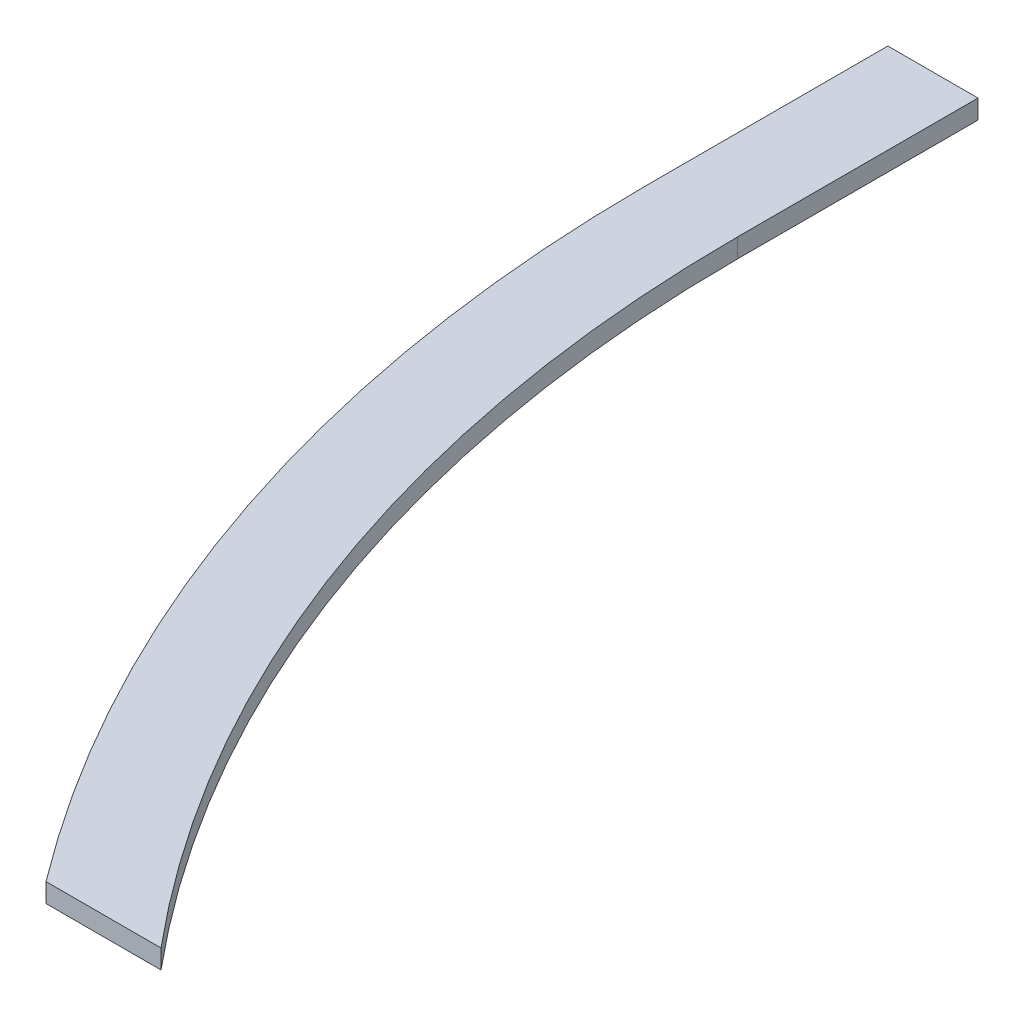
ISO-10303-21;
HEADER;
FILE_DESCRIPTION(('STEP AP214'),'2;1');
FILE_NAME('part.step','',(''),(''),'','','');
FILE_SCHEMA(('AUTOMOTIVE_DESIGN { 1 0 10303 214 1 1 1 1 }'));
ENDSEC;
DATA;
#1=APPLICATION_CONTEXT('core data for automotive mechanical design processes');
#2=APPLICATION_PROTOCOL_DEFINITION('international standard','automotive_design',2000,#1);
#3=PRODUCT_CONTEXT('',#1,'mechanical');
#4=PRODUCT('Part','Part','',(#3));
#5=PRODUCT_RELATED_PRODUCT_CATEGORY('part','',(#4));
#6=PRODUCT_DEFINITION_FORMATION('','',#4);
#7=PRODUCT_DEFINITION_CONTEXT('part definition',#1,'design');
#8=PRODUCT_DEFINITION('design','',#6,#7);
#9=PRODUCT_DEFINITION_SHAPE('','',#8);
#10=(LENGTH_UNIT() NAMED_UNIT(*) SI_UNIT(.MILLI.,.METRE.));
#11=(NAMED_UNIT(*) PLANE_ANGLE_UNIT() SI_UNIT($,.RADIAN.));
#12=(NAMED_UNIT(*) SI_UNIT($,.STERADIAN.) SOLID_ANGLE_UNIT());
#13=UNCERTAINTY_MEASURE_WITH_UNIT(LENGTH_MEASURE(1.E-05),#10,'distance_accuracy_value','');
#14=(GEOMETRIC_REPRESENTATION_CONTEXT(3) GLOBAL_UNCERTAINTY_ASSIGNED_CONTEXT((#13)) GLOBAL_UNIT_ASSIGNED_CONTEXT((#10,
#11,#12)) REPRESENTATION_CONTEXT('',''));
#15=CARTESIAN_POINT('',(0.,0.,0.));
#16=DIRECTION('',(0.,0.,1.));
#17=DIRECTION('',(1.,0.,0.));
#18=AXIS2_PLACEMENT_3D('',#15,#16,#17);
#19=CARTESIAN_POINT('',(0.,0.,301.));
#20=DIRECTION('',(0.,0.,-1.));
#21=DIRECTION('',(-1.,0.,0.));
#22=AXIS2_PLACEMENT_3D('',#19,#20,#21);
#23=PLANE('',#22);
#24=DIRECTION('',(-1.,0.,0.));
#25=VECTOR('',#24,1.);
#26=CARTESIAN_POINT('',(0.,6.35,301.));
#27=LINE('',#26,#25);
#28=CARTESIAN_POINT('',(-360.969527799785,6.35,301.));
#29=VERTEX_POINT('',#28);
#30=CARTESIAN_POINT('',(-399.248043201216,6.35,301.));
#31=VERTEX_POINT('',#30);
#32=EDGE_CURVE('E12',#29,#31,#27,.T.);
#33=ORIENTED_EDGE('',*,*,#32,.T.);
#34=DIRECTION('',(0.,-1.,0.));
#35=VECTOR('',#34,1.);
#36=CARTESIAN_POINT('',(-399.248043201216,6.35,301.));
#37=LINE('',#36,#35);
#38=CARTESIAN_POINT('',(-399.248043201216,0.,301.));
#39=VERTEX_POINT('',#38);
#40=EDGE_CURVE('E62',#39,#31,#37,.F.);
#41=ORIENTED_EDGE('',*,*,#40,.F.);
#42=DIRECTION('',(-1.,0.,0.));
#43=VECTOR('',#42,1.);
#44=CARTESIAN_POINT('',(0.,0.,301.));
#45=LINE('',#44,#43);
#46=CARTESIAN_POINT('',(-360.969527799785,0.,301.));
#47=VERTEX_POINT('',#46);
#48=EDGE_CURVE('E136',#47,#39,#45,.T.);
#49=ORIENTED_EDGE('',*,*,#48,.F.);
#50=DIRECTION('',(0.,-1.,0.));
#51=VECTOR('',#50,1.);
#52=CARTESIAN_POINT('',(-360.969527799785,6.35,301.));
#53=LINE('',#52,#51);
#54=EDGE_CURVE('E49',#47,#29,#53,.F.);
#55=ORIENTED_EDGE('',*,*,#54,.T.);
#56=EDGE_LOOP('',(#33,#41,#49,#55));
#57=FACE_BOUND('',#56,.T.);
#58=ADVANCED_FACE('F42',(#57),#23,.F.);
#59=CARTESIAN_POINT('',(-470.,6.35,-79.9999999999999));
#60=DIRECTION('',(-1.,0.,0.));
#61=DIRECTION('',(0.,0.,1.));
#62=AXIS2_PLACEMENT_3D('',#59,#60,#61);
#63=PLANE('',#62);
#64=DIRECTION('',(0.,-1.,0.));
#65=VECTOR('',#64,1.);
#66=CARTESIAN_POINT('',(-470.,6.35,0.));
#67=LINE('',#66,#65);
#68=CARTESIAN_POINT('',(-470.,6.35,0.));
#69=VERTEX_POINT('',#68);
#70=CARTESIAN_POINT('',(-470.,0.,0.));
#71=VERTEX_POINT('',#70);
#72=EDGE_CURVE('E117',#69,#71,#67,.T.);
#73=ORIENTED_EDGE('',*,*,#72,.T.);
#74=DIRECTION('',(0.,0.,1.));
#75=VECTOR('',#74,1.);
#76=CARTESIAN_POINT('',(-470.,0.,-79.9999999999999));
#77=LINE('',#76,#75);
#78=CARTESIAN_POINT('',(-470.,0.,-79.9999999999999));
#79=VERTEX_POINT('',#78);
#80=EDGE_CURVE('E98',#79,#71,#77,.T.);
#81=ORIENTED_EDGE('',*,*,#80,.F.);
#82=DIRECTION('',(0.,-1.,0.));
#83=VECTOR('',#82,1.);
#84=CARTESIAN_POINT('',(-470.,6.35,-79.9999999999999));
#85=LINE('',#84,#83);
#86=CARTESIAN_POINT('',(-470.,6.35,-79.9999999999999));
#87=VERTEX_POINT('',#86);
#88=EDGE_CURVE('E106',#87,#79,#85,.T.);
#89=ORIENTED_EDGE('',*,*,#88,.F.);
#90=DIRECTION('',(0.,0.,1.));
#91=VECTOR('',#90,1.);
#92=CARTESIAN_POINT('',(-470.,6.35,-79.9999999999999));
#93=LINE('',#92,#91);
#94=EDGE_CURVE('E146',#87,#69,#93,.T.);
#95=ORIENTED_EDGE('',*,*,#94,.T.);
#96=EDGE_LOOP('',(#73,#81,#89,#95));
#97=FACE_BOUND('',#96,.T.);
#98=ADVANCED_FACE('F116',(#97),#63,.F.);
#99=CARTESIAN_POINT('',(0.,0.,-80.));
#100=DIRECTION('',(0.,0.,-1.));
#101=DIRECTION('',(-1.,0.,0.));
#102=AXIS2_PLACEMENT_3D('',#99,#100,#101);
#103=PLANE('',#102);
#104=ORIENTED_EDGE('',*,*,#88,.T.);
#105=DIRECTION('',(-1.,0.,0.));
#106=VECTOR('',#105,1.);
#107=CARTESIAN_POINT('',(-470.,0.,-79.9999999999999));
#108=LINE('',#107,#106);
#109=CARTESIAN_POINT('',(-500.,0.,-79.9999999999999));
#110=VERTEX_POINT('',#109);
#111=EDGE_CURVE('E93',#79,#110,#108,.T.);
#112=ORIENTED_EDGE('',*,*,#111,.T.);
#113=DIRECTION('',(0.,1.,0.));
#114=VECTOR('',#113,1.);
#115=CARTESIAN_POINT('',(-500.,0.,-79.9999999999999));
#116=LINE('',#115,#114);
#117=CARTESIAN_POINT('',(-500.,6.35,-79.9999999999999));
#118=VERTEX_POINT('',#117);
#119=EDGE_CURVE('E105',#110,#118,#116,.T.);
#120=ORIENTED_EDGE('',*,*,#119,.T.);
#121=DIRECTION('',(1.,0.,0.));
#122=VECTOR('',#121,1.);
#123=CARTESIAN_POINT('',(-500.,6.35,-79.9999999999999));
#124=LINE('',#123,#122);
#125=EDGE_CURVE('E111',#118,#87,#124,.T.);
#126=ORIENTED_EDGE('',*,*,#125,.T.);
#127=EDGE_LOOP('',(#104,#112,#120,#126));
#128=FACE_BOUND('',#127,.T.);
#129=ADVANCED_FACE('F109',(#128),#103,.T.);
#130=CARTESIAN_POINT('',(-500.,0.,-79.9999999999999));
#131=DIRECTION('',(1.,0.,0.));
#132=DIRECTION('',(0.,0.,-1.));
#133=AXIS2_PLACEMENT_3D('',#130,#131,#132);
#134=PLANE('',#133);
#135=DIRECTION('',(0.,-1.,0.));
#136=VECTOR('',#135,1.);
#137=CARTESIAN_POINT('',(-500.,6.35,0.));
#138=LINE('',#137,#136);
#139=CARTESIAN_POINT('',(-500.,6.35,0.));
#140=VERTEX_POINT('',#139);
#141=CARTESIAN_POINT('',(-500.,0.,0.));
#142=VERTEX_POINT('',#141);
#143=EDGE_CURVE('E131',#140,#142,#138,.T.);
#144=ORIENTED_EDGE('',*,*,#143,.F.);
#145=DIRECTION('',(0.,0.,1.));
#146=VECTOR('',#145,1.);
#147=CARTESIAN_POINT('',(-500.,6.35,-79.9999999999999));
#148=LINE('',#147,#146);
#149=EDGE_CURVE('E122',#118,#140,#148,.T.);
#150=ORIENTED_EDGE('',*,*,#149,.F.);
#151=ORIENTED_EDGE('',*,*,#119,.F.);
#152=DIRECTION('',(0.,0.,1.));
#153=VECTOR('',#152,1.);
#154=CARTESIAN_POINT('',(-500.,0.,-79.9999999999999));
#155=LINE('',#154,#153);
#156=EDGE_CURVE('E102',#110,#142,#155,.T.);
#157=ORIENTED_EDGE('',*,*,#156,.T.);
#158=EDGE_LOOP('',(#144,#150,#151,#157));
#159=FACE_BOUND('',#158,.T.);
#160=ADVANCED_FACE('F143',(#159),#134,.F.);
#161=CARTESIAN_POINT('',(0.,6.35,0.));
#162=DIRECTION('',(0.,-1.,0.));
#163=DIRECTION('',(0.,0.,-1.));
#164=AXIS2_PLACEMENT_3D('',#161,#162,#163);
#165=CYLINDRICAL_SURFACE('',#164,500.);
#166=CARTESIAN_POINT('',(0.,0.,0.));
#167=DIRECTION('',(0.,1.,0.));
#168=DIRECTION('',(0.,0.,1.));
#169=AXIS2_PLACEMENT_3D('',#166,#167,#168);
#170=CIRCLE('',#169,500.);
#171=EDGE_CURVE('E120',#142,#39,#170,.T.);
#172=ORIENTED_EDGE('',*,*,#171,.T.);
#173=ORIENTED_EDGE('',*,*,#40,.T.);
#174=CARTESIAN_POINT('',(0.,6.35,0.));
#175=DIRECTION('',(0.,1.,0.));
#176=DIRECTION('',(0.,0.,1.));
#177=AXIS2_PLACEMENT_3D('',#174,#175,#176);
#178=CIRCLE('',#177,500.);
#179=EDGE_CURVE('E129',#140,#31,#178,.T.);
#180=ORIENTED_EDGE('',*,*,#179,.F.);
#181=ORIENTED_EDGE('',*,*,#143,.T.);
#182=EDGE_LOOP('',(#172,#173,#180,#181));
#183=FACE_BOUND('',#182,.T.);
#184=ADVANCED_FACE('F138',(#183),#165,.T.);
#185=CARTESIAN_POINT('',(0.,6.35,0.));
#186=DIRECTION('',(0.,-1.,0.));
#187=DIRECTION('',(0.,0.,-1.));
#188=AXIS2_PLACEMENT_3D('',#185,#186,#187);
#189=CYLINDRICAL_SURFACE('',#188,470.);
#190=ORIENTED_EDGE('',*,*,#54,.F.);
#191=CARTESIAN_POINT('',(0.,0.,0.));
#192=DIRECTION('',(0.,1.,0.));
#193=DIRECTION('',(0.,0.,1.));
#194=AXIS2_PLACEMENT_3D('',#191,#192,#193);
#195=CIRCLE('',#194,470.);
#196=EDGE_CURVE('E118',#71,#47,#195,.T.);
#197=ORIENTED_EDGE('',*,*,#196,.F.);
#198=ORIENTED_EDGE('',*,*,#72,.F.);
#199=CARTESIAN_POINT('',(0.,6.35,0.));
#200=DIRECTION('',(0.,1.,0.));
#201=DIRECTION('',(0.,0.,1.));
#202=AXIS2_PLACEMENT_3D('',#199,#200,#201);
#203=CIRCLE('',#202,470.);
#204=EDGE_CURVE('E126',#69,#29,#203,.T.);
#205=ORIENTED_EDGE('',*,*,#204,.T.);
#206=EDGE_LOOP('',(#190,#197,#198,#205));
#207=FACE_BOUND('',#206,.T.);
#208=ADVANCED_FACE('F152',(#207),#189,.F.);
#209=CARTESIAN_POINT('',(0.,0.,0.));
#210=DIRECTION('',(0.,1.,0.));
#211=DIRECTION('',(0.,0.,1.));
#212=AXIS2_PLACEMENT_3D('',#209,#210,#211);
#213=PLANE('',#212);
#214=ORIENTED_EDGE('',*,*,#196,.T.);
#215=ORIENTED_EDGE('',*,*,#48,.T.);
#216=ORIENTED_EDGE('',*,*,#171,.F.);
#217=ORIENTED_EDGE('',*,*,#156,.F.);
#218=ORIENTED_EDGE('',*,*,#111,.F.);
#219=ORIENTED_EDGE('',*,*,#80,.T.);
#220=EDGE_LOOP('',(#214,#215,#216,#217,#218,#219));
#221=FACE_BOUND('',#220,.T.);
#222=ADVANCED_FACE('F96',(#221),#213,.F.);
#223=CARTESIAN_POINT('',(0.,6.35,0.));
#224=DIRECTION('',(0.,1.,0.));
#225=DIRECTION('',(0.,0.,1.));
#226=AXIS2_PLACEMENT_3D('',#223,#224,#225);
#227=PLANE('',#226);
#228=ORIENTED_EDGE('',*,*,#32,.F.);
#229=ORIENTED_EDGE('',*,*,#204,.F.);
#230=ORIENTED_EDGE('',*,*,#94,.F.);
#231=ORIENTED_EDGE('',*,*,#125,.F.);
#232=ORIENTED_EDGE('',*,*,#149,.T.);
#233=ORIENTED_EDGE('',*,*,#179,.T.);
#234=EDGE_LOOP('',(#228,#229,#230,#231,#232,#233));
#235=FACE_BOUND('',#234,.T.);
#236=ADVANCED_FACE('F145',(#235),#227,.T.);
#237=CLOSED_SHELL('',(#58,#98,#129,#160,#184,#208,#222,#236));
#238=MANIFOLD_SOLID_BREP('B2',#237);
#239=ADVANCED_BREP_SHAPE_REPRESENTATION('',(#18,#238),#14);
#240=SHAPE_DEFINITION_REPRESENTATION(#9,#239);
ENDSEC;
END-ISO-10303-21;
